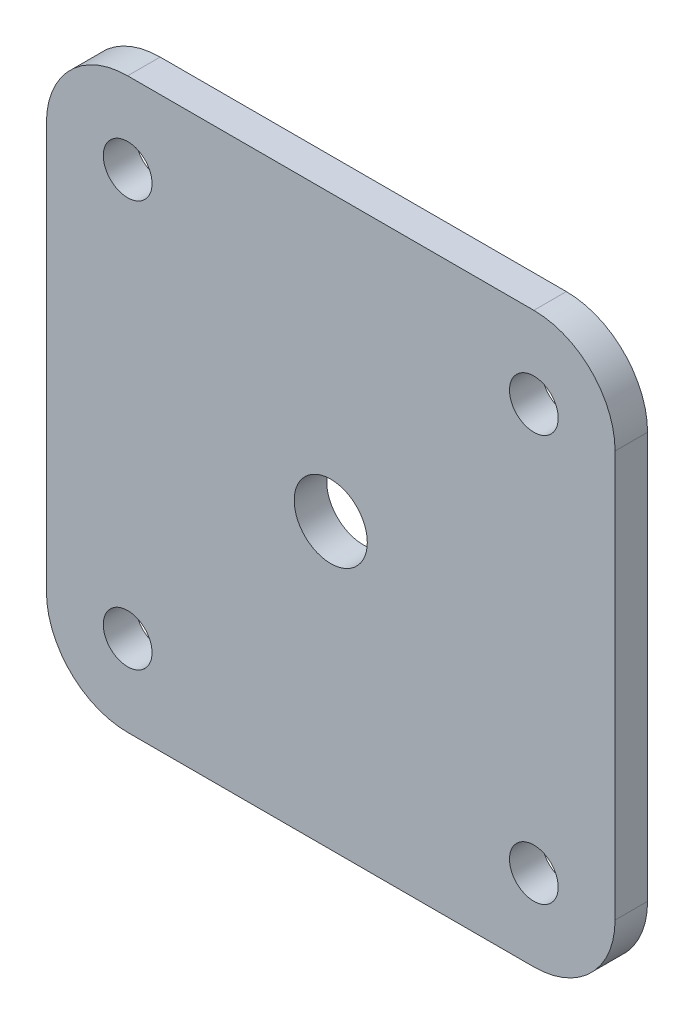
ISO-10303-21;
HEADER;
FILE_DESCRIPTION(('STEP AP214'),'2;1');
FILE_NAME('part.step','',(''),(''),'','','');
FILE_SCHEMA(('AUTOMOTIVE_DESIGN { 1 0 10303 214 1 1 1 1 }'));
ENDSEC;
DATA;
#1=APPLICATION_CONTEXT('core data for automotive mechanical design processes');
#2=APPLICATION_PROTOCOL_DEFINITION('international standard','automotive_design',2000,#1);
#3=PRODUCT_CONTEXT('',#1,'mechanical');
#4=PRODUCT('Part','Part','',(#3));
#5=PRODUCT_RELATED_PRODUCT_CATEGORY('part','',(#4));
#6=PRODUCT_DEFINITION_FORMATION('','',#4);
#7=PRODUCT_DEFINITION_CONTEXT('part definition',#1,'design');
#8=PRODUCT_DEFINITION('design','',#6,#7);
#9=PRODUCT_DEFINITION_SHAPE('','',#8);
#10=(LENGTH_UNIT() NAMED_UNIT(*) SI_UNIT(.MILLI.,.METRE.));
#11=(NAMED_UNIT(*) PLANE_ANGLE_UNIT() SI_UNIT($,.RADIAN.));
#12=(NAMED_UNIT(*) SI_UNIT($,.STERADIAN.) SOLID_ANGLE_UNIT());
#13=UNCERTAINTY_MEASURE_WITH_UNIT(LENGTH_MEASURE(1.E-05),#10,'distance_accuracy_value','');
#14=(GEOMETRIC_REPRESENTATION_CONTEXT(3) GLOBAL_UNCERTAINTY_ASSIGNED_CONTEXT((#13)) GLOBAL_UNIT_ASSIGNED_CONTEXT((#10,
#11,#12)) REPRESENTATION_CONTEXT('',''));
#15=CARTESIAN_POINT('',(0.,0.,0.));
#16=DIRECTION('',(0.,0.,1.));
#17=DIRECTION('',(1.,0.,0.));
#18=AXIS2_PLACEMENT_3D('',#15,#16,#17);
#19=CARTESIAN_POINT('',(0.,0.,2.));
#20=DIRECTION('',(0.,0.,-1.));
#21=DIRECTION('',(-1.,0.,0.));
#22=AXIS2_PLACEMENT_3D('',#19,#20,#21);
#23=PLANE('',#22);
#24=CARTESIAN_POINT('',(-12.4999999999993,-12.5,2.));
#25=DIRECTION('',(0.,0.,1.));
#26=DIRECTION('',(1.,0.,0.));
#27=AXIS2_PLACEMENT_3D('',#24,#25,#26);
#28=CIRCLE('',#27,1.50000000000038);
#29=CARTESIAN_POINT('',(-10.9999999999989,-12.5,2.));
#30=VERTEX_POINT('',#29);
#31=EDGE_CURVE('E184',#30,#30,#28,.T.);
#32=ORIENTED_EDGE('',*,*,#31,.F.);
#33=EDGE_LOOP('',(#32));
#34=FACE_BOUND('',#33,.T.);
#35=CARTESIAN_POINT('',(12.5000000000007,-12.4999999999993,2.));
#36=DIRECTION('',(0.,0.,1.));
#37=DIRECTION('',(1.,0.,0.));
#38=AXIS2_PLACEMENT_3D('',#35,#36,#37);
#39=CIRCLE('',#38,1.50000000000099);
#40=CARTESIAN_POINT('',(14.0000000000017,-12.4999999999993,2.));
#41=VERTEX_POINT('',#40);
#42=EDGE_CURVE('E190',#41,#41,#39,.T.);
#43=ORIENTED_EDGE('',*,*,#42,.F.);
#44=EDGE_LOOP('',(#43));
#45=FACE_BOUND('',#44,.T.);
#46=CARTESIAN_POINT('',(12.5,12.5000000000007,2.));
#47=DIRECTION('',(0.,0.,1.));
#48=DIRECTION('',(1.,0.,0.));
#49=AXIS2_PLACEMENT_3D('',#46,#47,#48);
#50=CIRCLE('',#49,1.50000000000072);
#51=CARTESIAN_POINT('',(14.0000000000007,12.5000000000007,2.));
#52=VERTEX_POINT('',#51);
#53=EDGE_CURVE('E196',#52,#52,#50,.T.);
#54=ORIENTED_EDGE('',*,*,#53,.F.);
#55=EDGE_LOOP('',(#54));
#56=FACE_BOUND('',#55,.T.);
#57=CARTESIAN_POINT('',(-12.5,12.5,2.));
#58=DIRECTION('',(0.,0.,1.));
#59=DIRECTION('',(1.,0.,0.));
#60=AXIS2_PLACEMENT_3D('',#57,#58,#59);
#61=CIRCLE('',#60,1.5);
#62=CARTESIAN_POINT('',(-11.,12.5,2.));
#63=VERTEX_POINT('',#62);
#64=EDGE_CURVE('E178',#63,#63,#61,.T.);
#65=ORIENTED_EDGE('',*,*,#64,.F.);
#66=EDGE_LOOP('',(#65));
#67=FACE_BOUND('',#66,.T.);
#68=DIRECTION('',(0.,-1.,0.));
#69=VECTOR('',#68,1.);
#70=CARTESIAN_POINT('',(-17.5,-17.5,2.));
#71=LINE('',#70,#69);
#72=CARTESIAN_POINT('',(-17.5,12.5,2.));
#73=VERTEX_POINT('',#72);
#74=CARTESIAN_POINT('',(-17.5,-12.5,2.));
#75=VERTEX_POINT('',#74);
#76=EDGE_CURVE('E171',#73,#75,#71,.T.);
#77=ORIENTED_EDGE('',*,*,#76,.T.);
#78=CARTESIAN_POINT('',(-12.5,-12.5,2.));
#79=DIRECTION('',(0.,0.,-1.));
#80=DIRECTION('',(-1.,0.,0.));
#81=AXIS2_PLACEMENT_3D('',#78,#79,#80);
#82=CIRCLE('',#81,5.);
#83=CARTESIAN_POINT('',(-12.5,-17.5,2.));
#84=VERTEX_POINT('',#83);
#85=EDGE_CURVE('E148',#75,#84,#82,.F.);
#86=ORIENTED_EDGE('',*,*,#85,.T.);
#87=DIRECTION('',(1.,0.,0.));
#88=VECTOR('',#87,1.);
#89=CARTESIAN_POINT('',(-17.5,-17.5,2.));
#90=LINE('',#89,#88);
#91=CARTESIAN_POINT('',(12.5,-17.5,2.));
#92=VERTEX_POINT('',#91);
#93=EDGE_CURVE('E119',#84,#92,#90,.T.);
#94=ORIENTED_EDGE('',*,*,#93,.T.);
#95=CARTESIAN_POINT('',(12.5,-12.5,2.));
#96=DIRECTION('',(0.,0.,-1.));
#97=DIRECTION('',(-1.,0.,0.));
#98=AXIS2_PLACEMENT_3D('',#95,#96,#97);
#99=CIRCLE('',#98,5.);
#100=CARTESIAN_POINT('',(17.5,-12.5,2.));
#101=VERTEX_POINT('',#100);
#102=EDGE_CURVE('E146',#92,#101,#99,.F.);
#103=ORIENTED_EDGE('',*,*,#102,.T.);
#104=DIRECTION('',(0.,1.,0.));
#105=VECTOR('',#104,1.);
#106=CARTESIAN_POINT('',(17.5,-17.5,2.));
#107=LINE('',#106,#105);
#108=CARTESIAN_POINT('',(17.5,12.5,2.));
#109=VERTEX_POINT('',#108);
#110=EDGE_CURVE('E126',#101,#109,#107,.T.);
#111=ORIENTED_EDGE('',*,*,#110,.T.);
#112=CARTESIAN_POINT('',(12.5,12.5,2.));
#113=DIRECTION('',(0.,0.,-1.));
#114=DIRECTION('',(-1.,0.,0.));
#115=AXIS2_PLACEMENT_3D('',#112,#113,#114);
#116=CIRCLE('',#115,5.);
#117=CARTESIAN_POINT('',(12.5,17.5,2.));
#118=VERTEX_POINT('',#117);
#119=EDGE_CURVE('E54',#109,#118,#116,.F.);
#120=ORIENTED_EDGE('',*,*,#119,.T.);
#121=DIRECTION('',(-1.,0.,0.));
#122=VECTOR('',#121,1.);
#123=CARTESIAN_POINT('',(-17.5,17.5,2.));
#124=LINE('',#123,#122);
#125=CARTESIAN_POINT('',(-12.5,17.5,2.));
#126=VERTEX_POINT('',#125);
#127=EDGE_CURVE('E129',#118,#126,#124,.T.);
#128=ORIENTED_EDGE('',*,*,#127,.T.);
#129=CARTESIAN_POINT('',(-12.5,12.5,2.));
#130=DIRECTION('',(0.,0.,-1.));
#131=DIRECTION('',(-1.,0.,0.));
#132=AXIS2_PLACEMENT_3D('',#129,#130,#131);
#133=CIRCLE('',#132,5.);
#134=EDGE_CURVE('E143',#126,#73,#133,.F.);
#135=ORIENTED_EDGE('',*,*,#134,.T.);
#136=EDGE_LOOP('',(#77,#86,#94,#103,#111,#120,#128,#135));
#137=FACE_BOUND('',#136,.T.);
#138=CARTESIAN_POINT('',(0.,0.,2.));
#139=DIRECTION('',(0.,0.,1.));
#140=DIRECTION('',(1.,0.,0.));
#141=AXIS2_PLACEMENT_3D('',#138,#139,#140);
#142=CIRCLE('',#141,2.25);
#143=CARTESIAN_POINT('',(2.25,0.,2.));
#144=VERTEX_POINT('',#143);
#145=EDGE_CURVE('E164',#144,#144,#142,.T.);
#146=ORIENTED_EDGE('',*,*,#145,.F.);
#147=EDGE_LOOP('',(#146));
#148=FACE_BOUND('',#147,.T.);
#149=ADVANCED_FACE('F33',(#34,#45,#56,#67,#137,#148),#23,.F.);
#150=CARTESIAN_POINT('',(0.,0.,0.));
#151=DIRECTION('',(0.,0.,-1.));
#152=DIRECTION('',(-1.,0.,0.));
#153=AXIS2_PLACEMENT_3D('',#150,#151,#152);
#154=PLANE('',#153);
#155=CARTESIAN_POINT('',(-12.4999999999993,-12.5,0.));
#156=DIRECTION('',(0.,0.,1.));
#157=DIRECTION('',(1.,0.,0.));
#158=AXIS2_PLACEMENT_3D('',#155,#156,#157);
#159=CIRCLE('',#158,1.50000000000038);
#160=CARTESIAN_POINT('',(-10.9999999999989,-12.5,0.));
#161=VERTEX_POINT('',#160);
#162=EDGE_CURVE('E187',#161,#161,#159,.T.);
#163=ORIENTED_EDGE('',*,*,#162,.T.);
#164=EDGE_LOOP('',(#163));
#165=FACE_BOUND('',#164,.T.);
#166=CARTESIAN_POINT('',(12.5000000000007,-12.4999999999993,0.));
#167=DIRECTION('',(0.,0.,1.));
#168=DIRECTION('',(1.,0.,0.));
#169=AXIS2_PLACEMENT_3D('',#166,#167,#168);
#170=CIRCLE('',#169,1.50000000000099);
#171=CARTESIAN_POINT('',(14.0000000000017,-12.4999999999993,0.));
#172=VERTEX_POINT('',#171);
#173=EDGE_CURVE('E193',#172,#172,#170,.T.);
#174=ORIENTED_EDGE('',*,*,#173,.T.);
#175=EDGE_LOOP('',(#174));
#176=FACE_BOUND('',#175,.T.);
#177=CARTESIAN_POINT('',(12.5,12.5000000000007,0.));
#178=DIRECTION('',(0.,0.,1.));
#179=DIRECTION('',(1.,0.,0.));
#180=AXIS2_PLACEMENT_3D('',#177,#178,#179);
#181=CIRCLE('',#180,1.50000000000072);
#182=CARTESIAN_POINT('',(14.0000000000007,12.5000000000007,0.));
#183=VERTEX_POINT('',#182);
#184=EDGE_CURVE('E181',#183,#183,#181,.T.);
#185=ORIENTED_EDGE('',*,*,#184,.T.);
#186=EDGE_LOOP('',(#185));
#187=FACE_BOUND('',#186,.T.);
#188=CARTESIAN_POINT('',(-12.5,12.5,0.));
#189=DIRECTION('',(0.,0.,1.));
#190=DIRECTION('',(1.,0.,0.));
#191=AXIS2_PLACEMENT_3D('',#188,#189,#190);
#192=CIRCLE('',#191,1.5);
#193=CARTESIAN_POINT('',(-11.,12.5,0.));
#194=VERTEX_POINT('',#193);
#195=EDGE_CURVE('E176',#194,#194,#192,.T.);
#196=ORIENTED_EDGE('',*,*,#195,.T.);
#197=EDGE_LOOP('',(#196));
#198=FACE_BOUND('',#197,.T.);
#199=DIRECTION('',(1.,0.,0.));
#200=VECTOR('',#199,1.);
#201=CARTESIAN_POINT('',(-17.5,-17.5,0.));
#202=LINE('',#201,#200);
#203=CARTESIAN_POINT('',(-12.5,-17.5,0.));
#204=VERTEX_POINT('',#203);
#205=CARTESIAN_POINT('',(12.5,-17.5,0.));
#206=VERTEX_POINT('',#205);
#207=EDGE_CURVE('E116',#204,#206,#202,.T.);
#208=ORIENTED_EDGE('',*,*,#207,.F.);
#209=CARTESIAN_POINT('',(-12.5,-12.5,0.));
#210=DIRECTION('',(0.,0.,-1.));
#211=DIRECTION('',(-1.,0.,0.));
#212=AXIS2_PLACEMENT_3D('',#209,#210,#211);
#213=CIRCLE('',#212,5.);
#214=CARTESIAN_POINT('',(-17.5,-12.5,0.));
#215=VERTEX_POINT('',#214);
#216=EDGE_CURVE('E99',#204,#215,#213,.T.);
#217=ORIENTED_EDGE('',*,*,#216,.T.);
#218=DIRECTION('',(0.,-1.,0.));
#219=VECTOR('',#218,1.);
#220=CARTESIAN_POINT('',(-17.5,-17.5,0.));
#221=LINE('',#220,#219);
#222=CARTESIAN_POINT('',(-17.5,12.5,0.));
#223=VERTEX_POINT('',#222);
#224=EDGE_CURVE('E127',#223,#215,#221,.T.);
#225=ORIENTED_EDGE('',*,*,#224,.F.);
#226=CARTESIAN_POINT('',(-12.5,12.5,0.));
#227=DIRECTION('',(0.,0.,-1.));
#228=DIRECTION('',(-1.,0.,0.));
#229=AXIS2_PLACEMENT_3D('',#226,#227,#228);
#230=CIRCLE('',#229,5.);
#231=CARTESIAN_POINT('',(-12.5,17.5,0.));
#232=VERTEX_POINT('',#231);
#233=EDGE_CURVE('E120',#223,#232,#230,.T.);
#234=ORIENTED_EDGE('',*,*,#233,.T.);
#235=DIRECTION('',(-1.,0.,0.));
#236=VECTOR('',#235,1.);
#237=CARTESIAN_POINT('',(-17.5,17.5,0.));
#238=LINE('',#237,#236);
#239=CARTESIAN_POINT('',(12.5,17.5,0.));
#240=VERTEX_POINT('',#239);
#241=EDGE_CURVE('E131',#240,#232,#238,.T.);
#242=ORIENTED_EDGE('',*,*,#241,.F.);
#243=CARTESIAN_POINT('',(12.5,12.5,0.));
#244=DIRECTION('',(0.,0.,-1.));
#245=DIRECTION('',(-1.,0.,0.));
#246=AXIS2_PLACEMENT_3D('',#243,#244,#245);
#247=CIRCLE('',#246,5.);
#248=CARTESIAN_POINT('',(17.5,12.5,0.));
#249=VERTEX_POINT('',#248);
#250=EDGE_CURVE('E137',#240,#249,#247,.T.);
#251=ORIENTED_EDGE('',*,*,#250,.T.);
#252=DIRECTION('',(0.,1.,0.));
#253=VECTOR('',#252,1.);
#254=CARTESIAN_POINT('',(17.5,-17.5,0.));
#255=LINE('',#254,#253);
#256=CARTESIAN_POINT('',(17.5,-12.5,0.));
#257=VERTEX_POINT('',#256);
#258=EDGE_CURVE('E159',#257,#249,#255,.T.);
#259=ORIENTED_EDGE('',*,*,#258,.F.);
#260=CARTESIAN_POINT('',(12.5,-12.5,0.));
#261=DIRECTION('',(0.,0.,-1.));
#262=DIRECTION('',(-1.,0.,0.));
#263=AXIS2_PLACEMENT_3D('',#260,#261,#262);
#264=CIRCLE('',#263,5.);
#265=EDGE_CURVE('E110',#257,#206,#264,.T.);
#266=ORIENTED_EDGE('',*,*,#265,.T.);
#267=EDGE_LOOP('',(#208,#217,#225,#234,#242,#251,#259,#266));
#268=FACE_BOUND('',#267,.T.);
#269=CARTESIAN_POINT('',(0.,0.,0.));
#270=DIRECTION('',(0.,0.,1.));
#271=DIRECTION('',(1.,0.,0.));
#272=AXIS2_PLACEMENT_3D('',#269,#270,#271);
#273=CIRCLE('',#272,2.25);
#274=CARTESIAN_POINT('',(2.25,0.,0.));
#275=VERTEX_POINT('',#274);
#276=EDGE_CURVE('E167',#275,#275,#273,.T.);
#277=ORIENTED_EDGE('',*,*,#276,.T.);
#278=EDGE_LOOP('',(#277));
#279=FACE_BOUND('',#278,.T.);
#280=ADVANCED_FACE('F123',(#165,#176,#187,#198,#268,#279),#154,.T.);
#281=CARTESIAN_POINT('',(17.5,-17.5,2.));
#282=DIRECTION('',(-1.,0.,0.));
#283=DIRECTION('',(0.,0.,1.));
#284=AXIS2_PLACEMENT_3D('',#281,#282,#283);
#285=PLANE('',#284);
#286=ORIENTED_EDGE('',*,*,#110,.F.);
#287=DIRECTION('',(0.,0.,-1.));
#288=VECTOR('',#287,1.);
#289=CARTESIAN_POINT('',(17.5,-12.5,2.));
#290=LINE('',#289,#288);
#291=EDGE_CURVE('E152',#101,#257,#290,.T.);
#292=ORIENTED_EDGE('',*,*,#291,.T.);
#293=ORIENTED_EDGE('',*,*,#258,.T.);
#294=DIRECTION('',(0.,0.,-1.));
#295=VECTOR('',#294,1.);
#296=CARTESIAN_POINT('',(17.5,12.5,2.));
#297=LINE('',#296,#295);
#298=EDGE_CURVE('E150',#249,#109,#297,.F.);
#299=ORIENTED_EDGE('',*,*,#298,.T.);
#300=EDGE_LOOP('',(#286,#292,#293,#299));
#301=FACE_BOUND('',#300,.T.);
#302=ADVANCED_FACE('F158',(#301),#285,.F.);
#303=CARTESIAN_POINT('',(-17.5,17.5,2.));
#304=DIRECTION('',(0.,-1.,0.));
#305=DIRECTION('',(0.,0.,-1.));
#306=AXIS2_PLACEMENT_3D('',#303,#304,#305);
#307=PLANE('',#306);
#308=ORIENTED_EDGE('',*,*,#127,.F.);
#309=DIRECTION('',(0.,0.,-1.));
#310=VECTOR('',#309,1.);
#311=CARTESIAN_POINT('',(12.5,17.5,2.));
#312=LINE('',#311,#310);
#313=EDGE_CURVE('E11',#118,#240,#312,.T.);
#314=ORIENTED_EDGE('',*,*,#313,.T.);
#315=ORIENTED_EDGE('',*,*,#241,.T.);
#316=DIRECTION('',(0.,0.,-1.));
#317=VECTOR('',#316,1.);
#318=CARTESIAN_POINT('',(-12.5,17.5,2.));
#319=LINE('',#318,#317);
#320=EDGE_CURVE('E41',#232,#126,#319,.F.);
#321=ORIENTED_EDGE('',*,*,#320,.T.);
#322=EDGE_LOOP('',(#308,#314,#315,#321));
#323=FACE_BOUND('',#322,.T.);
#324=ADVANCED_FACE('F233',(#323),#307,.F.);
#325=CARTESIAN_POINT('',(-17.5,-17.5,2.));
#326=DIRECTION('',(1.,0.,0.));
#327=DIRECTION('',(0.,0.,-1.));
#328=AXIS2_PLACEMENT_3D('',#325,#326,#327);
#329=PLANE('',#328);
#330=ORIENTED_EDGE('',*,*,#224,.T.);
#331=DIRECTION('',(0.,0.,-1.));
#332=VECTOR('',#331,1.);
#333=CARTESIAN_POINT('',(-17.5,-12.5,2.));
#334=LINE('',#333,#332);
#335=EDGE_CURVE('E104',#215,#75,#334,.F.);
#336=ORIENTED_EDGE('',*,*,#335,.T.);
#337=ORIENTED_EDGE('',*,*,#76,.F.);
#338=DIRECTION('',(0.,0.,-1.));
#339=VECTOR('',#338,1.);
#340=CARTESIAN_POINT('',(-17.5,12.5,2.));
#341=LINE('',#340,#339);
#342=EDGE_CURVE('E109',#73,#223,#341,.T.);
#343=ORIENTED_EDGE('',*,*,#342,.T.);
#344=EDGE_LOOP('',(#330,#336,#337,#343));
#345=FACE_BOUND('',#344,.T.);
#346=ADVANCED_FACE('F239',(#345),#329,.F.);
#347=CARTESIAN_POINT('',(-17.5,-17.5,2.));
#348=DIRECTION('',(0.,1.,0.));
#349=DIRECTION('',(0.,0.,1.));
#350=AXIS2_PLACEMENT_3D('',#347,#348,#349);
#351=PLANE('',#350);
#352=ORIENTED_EDGE('',*,*,#93,.F.);
#353=DIRECTION('',(0.,0.,-1.));
#354=VECTOR('',#353,1.);
#355=CARTESIAN_POINT('',(-12.5,-17.5,2.));
#356=LINE('',#355,#354);
#357=EDGE_CURVE('E103',#84,#204,#356,.T.);
#358=ORIENTED_EDGE('',*,*,#357,.T.);
#359=ORIENTED_EDGE('',*,*,#207,.T.);
#360=DIRECTION('',(0.,0.,-1.));
#361=VECTOR('',#360,1.);
#362=CARTESIAN_POINT('',(12.5,-17.5,2.));
#363=LINE('',#362,#361);
#364=EDGE_CURVE('E121',#206,#92,#363,.F.);
#365=ORIENTED_EDGE('',*,*,#364,.T.);
#366=EDGE_LOOP('',(#352,#358,#359,#365));
#367=FACE_BOUND('',#366,.T.);
#368=ADVANCED_FACE('F115',(#367),#351,.F.);
#369=CARTESIAN_POINT('',(0.,0.,2.));
#370=DIRECTION('',(0.,0.,-1.));
#371=DIRECTION('',(-1.,0.,0.));
#372=AXIS2_PLACEMENT_3D('',#369,#370,#371);
#373=CYLINDRICAL_SURFACE('',#372,2.25);
#374=ORIENTED_EDGE('',*,*,#145,.T.);
#375=EDGE_LOOP('',(#374));
#376=FACE_BOUND('',#375,.T.);
#377=ORIENTED_EDGE('',*,*,#276,.F.);
#378=EDGE_LOOP('',(#377));
#379=FACE_BOUND('',#378,.T.);
#380=ADVANCED_FACE('F221',(#376,#379),#373,.F.);
#381=CARTESIAN_POINT('',(-12.5,-12.5,2.));
#382=DIRECTION('',(0.,0.,-1.));
#383=DIRECTION('',(-1.,0.,0.));
#384=AXIS2_PLACEMENT_3D('',#381,#382,#383);
#385=CYLINDRICAL_SURFACE('',#384,5.);
#386=ORIENTED_EDGE('',*,*,#85,.F.);
#387=ORIENTED_EDGE('',*,*,#335,.F.);
#388=ORIENTED_EDGE('',*,*,#216,.F.);
#389=ORIENTED_EDGE('',*,*,#357,.F.);
#390=EDGE_LOOP('',(#386,#387,#388,#389));
#391=FACE_BOUND('',#390,.T.);
#392=ADVANCED_FACE('F102',(#391),#385,.T.);
#393=CARTESIAN_POINT('',(12.5,-12.5,2.));
#394=DIRECTION('',(0.,0.,-1.));
#395=DIRECTION('',(-1.,0.,0.));
#396=AXIS2_PLACEMENT_3D('',#393,#394,#395);
#397=CYLINDRICAL_SURFACE('',#396,5.);
#398=ORIENTED_EDGE('',*,*,#102,.F.);
#399=ORIENTED_EDGE('',*,*,#364,.F.);
#400=ORIENTED_EDGE('',*,*,#265,.F.);
#401=ORIENTED_EDGE('',*,*,#291,.F.);
#402=EDGE_LOOP('',(#398,#399,#400,#401));
#403=FACE_BOUND('',#402,.T.);
#404=ADVANCED_FACE('F247',(#403),#397,.T.);
#405=CARTESIAN_POINT('',(12.5,12.5,2.));
#406=DIRECTION('',(0.,0.,-1.));
#407=DIRECTION('',(-1.,0.,0.));
#408=AXIS2_PLACEMENT_3D('',#405,#406,#407);
#409=CYLINDRICAL_SURFACE('',#408,5.);
#410=ORIENTED_EDGE('',*,*,#119,.F.);
#411=ORIENTED_EDGE('',*,*,#298,.F.);
#412=ORIENTED_EDGE('',*,*,#250,.F.);
#413=ORIENTED_EDGE('',*,*,#313,.F.);
#414=EDGE_LOOP('',(#410,#411,#412,#413));
#415=FACE_BOUND('',#414,.T.);
#416=ADVANCED_FACE('F249',(#415),#409,.T.);
#417=CARTESIAN_POINT('',(-12.5,12.5,2.));
#418=DIRECTION('',(0.,0.,-1.));
#419=DIRECTION('',(-1.,0.,0.));
#420=AXIS2_PLACEMENT_3D('',#417,#418,#419);
#421=CYLINDRICAL_SURFACE('',#420,5.);
#422=ORIENTED_EDGE('',*,*,#134,.F.);
#423=ORIENTED_EDGE('',*,*,#320,.F.);
#424=ORIENTED_EDGE('',*,*,#233,.F.);
#425=ORIENTED_EDGE('',*,*,#342,.F.);
#426=EDGE_LOOP('',(#422,#423,#424,#425));
#427=FACE_BOUND('',#426,.T.);
#428=ADVANCED_FACE('F35',(#427),#421,.T.);
#429=CARTESIAN_POINT('',(-12.5,12.5,0.));
#430=DIRECTION('',(0.,0.,1.));
#431=DIRECTION('',(1.,0.,0.));
#432=AXIS2_PLACEMENT_3D('',#429,#430,#431);
#433=CYLINDRICAL_SURFACE('',#432,1.5);
#434=ORIENTED_EDGE('',*,*,#195,.F.);
#435=EDGE_LOOP('',(#434));
#436=FACE_BOUND('',#435,.T.);
#437=ORIENTED_EDGE('',*,*,#64,.T.);
#438=EDGE_LOOP('',(#437));
#439=FACE_BOUND('',#438,.T.);
#440=ADVANCED_FACE('F208',(#436,#439),#433,.F.);
#441=CARTESIAN_POINT('',(12.5,12.5000000000007,0.));
#442=DIRECTION('',(0.,0.,1.));
#443=DIRECTION('',(1.,0.,0.));
#444=AXIS2_PLACEMENT_3D('',#441,#442,#443);
#445=CYLINDRICAL_SURFACE('',#444,1.50000000000072);
#446=ORIENTED_EDGE('',*,*,#184,.F.);
#447=EDGE_LOOP('',(#446));
#448=FACE_BOUND('',#447,.T.);
#449=ORIENTED_EDGE('',*,*,#53,.T.);
#450=EDGE_LOOP('',(#449));
#451=FACE_BOUND('',#450,.T.);
#452=ADVANCED_FACE('F204',(#448,#451),#445,.F.);
#453=CARTESIAN_POINT('',(12.5000000000007,-12.4999999999993,0.));
#454=DIRECTION('',(0.,0.,1.));
#455=DIRECTION('',(1.,0.,0.));
#456=AXIS2_PLACEMENT_3D('',#453,#454,#455);
#457=CYLINDRICAL_SURFACE('',#456,1.50000000000099);
#458=ORIENTED_EDGE('',*,*,#173,.F.);
#459=EDGE_LOOP('',(#458));
#460=FACE_BOUND('',#459,.T.);
#461=ORIENTED_EDGE('',*,*,#42,.T.);
#462=EDGE_LOOP('',(#461));
#463=FACE_BOUND('',#462,.T.);
#464=ADVANCED_FACE('F207',(#460,#463),#457,.F.);
#465=CARTESIAN_POINT('',(-12.4999999999993,-12.5,0.));
#466=DIRECTION('',(0.,0.,1.));
#467=DIRECTION('',(1.,0.,0.));
#468=AXIS2_PLACEMENT_3D('',#465,#466,#467);
#469=CYLINDRICAL_SURFACE('',#468,1.50000000000038);
#470=ORIENTED_EDGE('',*,*,#162,.F.);
#471=EDGE_LOOP('',(#470));
#472=FACE_BOUND('',#471,.T.);
#473=ORIENTED_EDGE('',*,*,#31,.T.);
#474=EDGE_LOOP('',(#473));
#475=FACE_BOUND('',#474,.T.);
#476=ADVANCED_FACE('F268',(#472,#475),#469,.F.);
#477=CLOSED_SHELL('',(#149,#280,#302,#324,#346,#368,#380,#392,#404,#416,#428,#440,#452,#464,#476));
#478=MANIFOLD_SOLID_BREP('B2',#477);
#479=ADVANCED_BREP_SHAPE_REPRESENTATION('',(#18,#478),#14);
#480=SHAPE_DEFINITION_REPRESENTATION(#9,#479);
ENDSEC;
END-ISO-10303-21;
